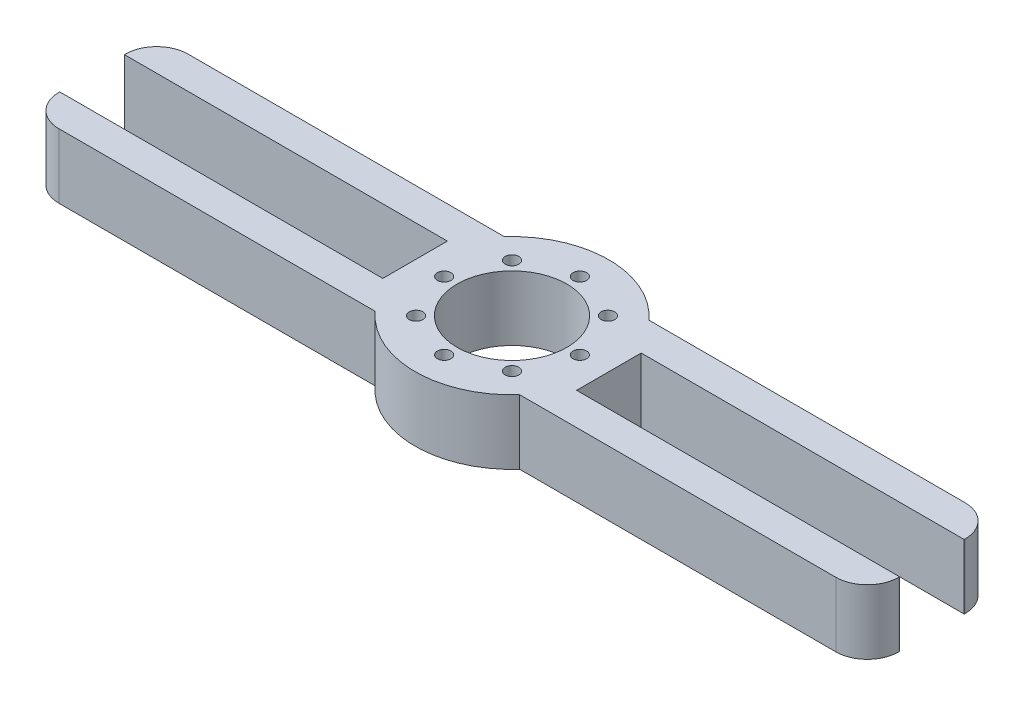
ISO-10303-21;
HEADER;
FILE_DESCRIPTION(('STEP AP214'),'2;1');
FILE_NAME('part.step','',(''),(''),'','','');
FILE_SCHEMA(('AUTOMOTIVE_DESIGN { 1 0 10303 214 1 1 1 1 }'));
ENDSEC;
DATA;
#1=APPLICATION_CONTEXT('core data for automotive mechanical design processes');
#2=APPLICATION_PROTOCOL_DEFINITION('international standard','automotive_design',2000,#1);
#3=PRODUCT_CONTEXT('',#1,'mechanical');
#4=PRODUCT('Part','Part','',(#3));
#5=PRODUCT_RELATED_PRODUCT_CATEGORY('part','',(#4));
#6=PRODUCT_DEFINITION_FORMATION('','',#4);
#7=PRODUCT_DEFINITION_CONTEXT('part definition',#1,'design');
#8=PRODUCT_DEFINITION('design','',#6,#7);
#9=PRODUCT_DEFINITION_SHAPE('','',#8);
#10=(LENGTH_UNIT() NAMED_UNIT(*) SI_UNIT(.MILLI.,.METRE.));
#11=(NAMED_UNIT(*) PLANE_ANGLE_UNIT() SI_UNIT($,.RADIAN.));
#12=(NAMED_UNIT(*) SI_UNIT($,.STERADIAN.) SOLID_ANGLE_UNIT());
#13=UNCERTAINTY_MEASURE_WITH_UNIT(LENGTH_MEASURE(1.E-05),#10,'distance_accuracy_value','');
#14=(GEOMETRIC_REPRESENTATION_CONTEXT(3) GLOBAL_UNCERTAINTY_ASSIGNED_CONTEXT((#13)) GLOBAL_UNIT_ASSIGNED_CONTEXT((#10,
#11,#12)) REPRESENTATION_CONTEXT('',''));
#15=CARTESIAN_POINT('',(0.,0.,0.));
#16=DIRECTION('',(0.,0.,1.));
#17=DIRECTION('',(1.,0.,0.));
#18=AXIS2_PLACEMENT_3D('',#15,#16,#17);
#19=CARTESIAN_POINT('',(0.,20.,0.));
#20=DIRECTION('',(0.,1.,0.));
#21=DIRECTION('',(0.,0.,1.));
#22=AXIS2_PLACEMENT_3D('',#19,#20,#21);
#23=PLANE('',#22);
#24=CARTESIAN_POINT('',(21.,20.,0.));
#25=DIRECTION('',(0.,1.,0.));
#26=DIRECTION('',(0.,0.,1.));
#27=AXIS2_PLACEMENT_3D('',#24,#25,#26);
#28=CIRCLE('',#27,2.1);
#29=CARTESIAN_POINT('',(21.,20.,2.1));
#30=VERTEX_POINT('',#29);
#31=EDGE_CURVE('E460',#30,#30,#28,.T.);
#32=ORIENTED_EDGE('',*,*,#31,.F.);
#33=EDGE_LOOP('',(#32));
#34=FACE_BOUND('',#33,.T.);
#35=CARTESIAN_POINT('',(14.8492424049175,20.,14.8492424049175));
#36=DIRECTION('',(0.,1.,0.));
#37=DIRECTION('',(0.,0.,1.));
#38=AXIS2_PLACEMENT_3D('',#35,#36,#37);
#39=CIRCLE('',#38,2.1);
#40=CARTESIAN_POINT('',(14.8492424049175,20.,16.9492424049175));
#41=VERTEX_POINT('',#40);
#42=EDGE_CURVE('E456',#41,#41,#39,.T.);
#43=ORIENTED_EDGE('',*,*,#42,.F.);
#44=EDGE_LOOP('',(#43));
#45=FACE_BOUND('',#44,.T.);
#46=CARTESIAN_POINT('',(0.,20.,21.));
#47=DIRECTION('',(0.,1.,0.));
#48=DIRECTION('',(0.,0.,1.));
#49=AXIS2_PLACEMENT_3D('',#46,#47,#48);
#50=CIRCLE('',#49,2.1);
#51=CARTESIAN_POINT('',(0.,20.,23.1));
#52=VERTEX_POINT('',#51);
#53=EDGE_CURVE('E448',#52,#52,#50,.T.);
#54=ORIENTED_EDGE('',*,*,#53,.F.);
#55=EDGE_LOOP('',(#54));
#56=FACE_BOUND('',#55,.T.);
#57=CARTESIAN_POINT('',(-14.8492424049176,20.,14.8492424049174));
#58=DIRECTION('',(0.,1.,0.));
#59=DIRECTION('',(0.,0.,1.));
#60=AXIS2_PLACEMENT_3D('',#57,#58,#59);
#61=CIRCLE('',#60,2.1);
#62=CARTESIAN_POINT('',(-14.8492424049176,20.,16.9492424049174));
#63=VERTEX_POINT('',#62);
#64=EDGE_CURVE('E440',#63,#63,#61,.T.);
#65=ORIENTED_EDGE('',*,*,#64,.F.);
#66=EDGE_LOOP('',(#65));
#67=FACE_BOUND('',#66,.T.);
#68=CARTESIAN_POINT('',(-21.,20.,-1.46642216231412E-13));
#69=DIRECTION('',(0.,1.,0.));
#70=DIRECTION('',(0.,0.,1.));
#71=AXIS2_PLACEMENT_3D('',#68,#69,#70);
#72=CIRCLE('',#71,2.1);
#73=CARTESIAN_POINT('',(-21.,20.,2.09999999999985));
#74=VERTEX_POINT('',#73);
#75=EDGE_CURVE('E432',#74,#74,#72,.T.);
#76=ORIENTED_EDGE('',*,*,#75,.F.);
#77=EDGE_LOOP('',(#76));
#78=FACE_BOUND('',#77,.T.);
#79=CARTESIAN_POINT('',(-14.8492424049174,20.,-14.8492424049176));
#80=DIRECTION('',(0.,1.,0.));
#81=DIRECTION('',(0.,0.,1.));
#82=AXIS2_PLACEMENT_3D('',#79,#80,#81);
#83=CIRCLE('',#82,2.1);
#84=CARTESIAN_POINT('',(-14.8492424049174,20.,-12.7492424049176));
#85=VERTEX_POINT('',#84);
#86=EDGE_CURVE('E424',#85,#85,#83,.T.);
#87=ORIENTED_EDGE('',*,*,#86,.F.);
#88=EDGE_LOOP('',(#87));
#89=FACE_BOUND('',#88,.T.);
#90=CARTESIAN_POINT('',(2.19963324347117E-13,20.,-21.));
#91=DIRECTION('',(0.,1.,0.));
#92=DIRECTION('',(0.,0.,1.));
#93=AXIS2_PLACEMENT_3D('',#90,#91,#92);
#94=CIRCLE('',#93,2.1);
#95=CARTESIAN_POINT('',(2.19963324347117E-13,20.,-18.9));
#96=VERTEX_POINT('',#95);
#97=EDGE_CURVE('E416',#96,#96,#94,.T.);
#98=ORIENTED_EDGE('',*,*,#97,.F.);
#99=EDGE_LOOP('',(#98));
#100=FACE_BOUND('',#99,.T.);
#101=CARTESIAN_POINT('',(14.8492424049177,20.,-14.8492424049173));
#102=DIRECTION('',(0.,1.,0.));
#103=DIRECTION('',(0.,0.,1.));
#104=AXIS2_PLACEMENT_3D('',#101,#102,#103);
#105=CIRCLE('',#104,2.1);
#106=CARTESIAN_POINT('',(14.8492424049177,20.,-12.7492424049173));
#107=VERTEX_POINT('',#106);
#108=EDGE_CURVE('E407',#107,#107,#105,.T.);
#109=ORIENTED_EDGE('',*,*,#108,.F.);
#110=EDGE_LOOP('',(#109));
#111=FACE_BOUND('',#110,.T.);
#112=DIRECTION('',(0.,0.,-1.));
#113=VECTOR('',#112,1.);
#114=CARTESIAN_POINT('',(-130.,20.,-20.));
#115=LINE('',#114,#113);
#116=CARTESIAN_POINT('',(-130.,20.,10.25));
#117=VERTEX_POINT('',#116);
#118=CARTESIAN_POINT('',(-130.,20.,10.));
#119=VERTEX_POINT('',#118);
#120=EDGE_CURVE('E183',#117,#119,#115,.T.);
#121=ORIENTED_EDGE('',*,*,#120,.F.);
#122=CARTESIAN_POINT('',(-120.25,20.,10.25));
#123=DIRECTION('',(0.,1.,0.));
#124=DIRECTION('',(0.,0.,1.));
#125=AXIS2_PLACEMENT_3D('',#122,#123,#124);
#126=CIRCLE('',#125,9.75);
#127=CARTESIAN_POINT('',(-120.25,20.,20.));
#128=VERTEX_POINT('',#127);
#129=EDGE_CURVE('E384',#117,#128,#126,.T.);
#130=ORIENTED_EDGE('',*,*,#129,.T.);
#131=DIRECTION('',(-1.,0.,0.));
#132=VECTOR('',#131,1.);
#133=CARTESIAN_POINT('',(-130.,20.,20.));
#134=LINE('',#133,#132);
#135=CARTESIAN_POINT('',(-22.3606797749979,20.,20.));
#136=VERTEX_POINT('',#135);
#137=EDGE_CURVE('E193',#136,#128,#134,.T.);
#138=ORIENTED_EDGE('',*,*,#137,.F.);
#139=CARTESIAN_POINT('',(0.,20.,0.));
#140=DIRECTION('',(0.,1.,0.));
#141=DIRECTION('',(0.,0.,1.));
#142=AXIS2_PLACEMENT_3D('',#139,#140,#141);
#143=CIRCLE('',#142,30.);
#144=CARTESIAN_POINT('',(22.3606797749979,20.,20.));
#145=VERTEX_POINT('',#144);
#146=EDGE_CURVE('E305',#136,#145,#143,.T.);
#147=ORIENTED_EDGE('',*,*,#146,.T.);
#148=DIRECTION('',(1.,0.,0.));
#149=VECTOR('',#148,1.);
#150=CARTESIAN_POINT('',(130.,20.,20.));
#151=LINE('',#150,#149);
#152=CARTESIAN_POINT('',(120.25,20.,20.));
#153=VERTEX_POINT('',#152);
#154=EDGE_CURVE('E309',#145,#153,#151,.T.);
#155=ORIENTED_EDGE('',*,*,#154,.T.);
#156=CARTESIAN_POINT('',(120.25,20.,10.25));
#157=DIRECTION('',(0.,1.,0.));
#158=DIRECTION('',(0.,0.,1.));
#159=AXIS2_PLACEMENT_3D('',#156,#157,#158);
#160=CIRCLE('',#159,9.75);
#161=CARTESIAN_POINT('',(130.,20.,10.25));
#162=VERTEX_POINT('',#161);
#163=EDGE_CURVE('E360',#153,#162,#160,.T.);
#164=ORIENTED_EDGE('',*,*,#163,.T.);
#165=DIRECTION('',(0.,0.,-1.));
#166=VECTOR('',#165,1.);
#167=CARTESIAN_POINT('',(130.,20.,-20.));
#168=LINE('',#167,#166);
#169=CARTESIAN_POINT('',(130.,20.,10.));
#170=VERTEX_POINT('',#169);
#171=EDGE_CURVE('E314',#162,#170,#168,.T.);
#172=ORIENTED_EDGE('',*,*,#171,.T.);
#173=DIRECTION('',(1.,0.,0.));
#174=VECTOR('',#173,1.);
#175=CARTESIAN_POINT('',(30.,20.,10.));
#176=LINE('',#175,#174);
#177=CARTESIAN_POINT('',(30.,20.,10.));
#178=VERTEX_POINT('',#177);
#179=EDGE_CURVE('E274',#178,#170,#176,.T.);
#180=ORIENTED_EDGE('',*,*,#179,.F.);
#181=DIRECTION('',(0.,0.,1.));
#182=VECTOR('',#181,1.);
#183=CARTESIAN_POINT('',(30.,20.,-10.));
#184=LINE('',#183,#182);
#185=CARTESIAN_POINT('',(30.,20.,-10.));
#186=VERTEX_POINT('',#185);
#187=EDGE_CURVE('E289',#186,#178,#184,.T.);
#188=ORIENTED_EDGE('',*,*,#187,.F.);
#189=DIRECTION('',(-1.,0.,0.));
#190=VECTOR('',#189,1.);
#191=CARTESIAN_POINT('',(130.,20.,-10.));
#192=LINE('',#191,#190);
#193=CARTESIAN_POINT('',(130.,20.,-10.));
#194=VERTEX_POINT('',#193);
#195=EDGE_CURVE('E267',#194,#186,#192,.T.);
#196=ORIENTED_EDGE('',*,*,#195,.F.);
#197=CARTESIAN_POINT('',(130.,20.,-10.25));
#198=VERTEX_POINT('',#197);
#199=EDGE_CURVE('E313',#194,#198,#168,.T.);
#200=ORIENTED_EDGE('',*,*,#199,.T.);
#201=CARTESIAN_POINT('',(120.25,20.,-10.25));
#202=DIRECTION('',(0.,1.,0.));
#203=DIRECTION('',(0.,0.,1.));
#204=AXIS2_PLACEMENT_3D('',#201,#202,#203);
#205=CIRCLE('',#204,9.75);
#206=CARTESIAN_POINT('',(120.25,20.,-20.));
#207=VERTEX_POINT('',#206);
#208=EDGE_CURVE('E357',#198,#207,#205,.T.);
#209=ORIENTED_EDGE('',*,*,#208,.T.);
#210=DIRECTION('',(-1.,0.,0.));
#211=VECTOR('',#210,1.);
#212=CARTESIAN_POINT('',(22.3606797749979,20.,-20.));
#213=LINE('',#212,#211);
#214=CARTESIAN_POINT('',(22.3606797749979,20.,-20.));
#215=VERTEX_POINT('',#214);
#216=EDGE_CURVE('E317',#207,#215,#213,.T.);
#217=ORIENTED_EDGE('',*,*,#216,.T.);
#218=CARTESIAN_POINT('',(0.,20.,0.));
#219=DIRECTION('',(0.,1.,0.));
#220=DIRECTION('',(0.,0.,1.));
#221=AXIS2_PLACEMENT_3D('',#218,#219,#220);
#222=CIRCLE('',#221,30.);
#223=CARTESIAN_POINT('',(-22.3606797749979,20.,-20.));
#224=VERTEX_POINT('',#223);
#225=EDGE_CURVE('E301',#215,#224,#222,.T.);
#226=ORIENTED_EDGE('',*,*,#225,.T.);
#227=DIRECTION('',(1.,0.,0.));
#228=VECTOR('',#227,1.);
#229=CARTESIAN_POINT('',(-22.3606797749979,20.,-20.));
#230=LINE('',#229,#228);
#231=CARTESIAN_POINT('',(-120.25,20.,-20.));
#232=VERTEX_POINT('',#231);
#233=EDGE_CURVE('E231',#232,#224,#230,.T.);
#234=ORIENTED_EDGE('',*,*,#233,.F.);
#235=CARTESIAN_POINT('',(-120.25,20.,-10.25));
#236=DIRECTION('',(0.,1.,0.));
#237=DIRECTION('',(0.,0.,1.));
#238=AXIS2_PLACEMENT_3D('',#235,#236,#237);
#239=CIRCLE('',#238,9.75);
#240=CARTESIAN_POINT('',(-130.,20.,-10.25));
#241=VERTEX_POINT('',#240);
#242=EDGE_CURVE('E61',#232,#241,#239,.T.);
#243=ORIENTED_EDGE('',*,*,#242,.T.);
#244=CARTESIAN_POINT('',(-130.,20.,-10.));
#245=VERTEX_POINT('',#244);
#246=EDGE_CURVE('E194',#245,#241,#115,.T.);
#247=ORIENTED_EDGE('',*,*,#246,.F.);
#248=DIRECTION('',(1.,0.,0.));
#249=VECTOR('',#248,1.);
#250=CARTESIAN_POINT('',(-130.,20.,-10.));
#251=LINE('',#250,#249);
#252=CARTESIAN_POINT('',(-30.,20.,-10.));
#253=VERTEX_POINT('',#252);
#254=EDGE_CURVE('E214',#245,#253,#251,.T.);
#255=ORIENTED_EDGE('',*,*,#254,.T.);
#256=DIRECTION('',(0.,0.,1.));
#257=VECTOR('',#256,1.);
#258=CARTESIAN_POINT('',(-30.,20.,-10.));
#259=LINE('',#258,#257);
#260=CARTESIAN_POINT('',(-30.,20.,10.));
#261=VERTEX_POINT('',#260);
#262=EDGE_CURVE('E212',#253,#261,#259,.T.);
#263=ORIENTED_EDGE('',*,*,#262,.T.);
#264=DIRECTION('',(-1.,0.,0.));
#265=VECTOR('',#264,1.);
#266=CARTESIAN_POINT('',(-30.,20.,10.));
#267=LINE('',#266,#265);
#268=EDGE_CURVE('E201',#261,#119,#267,.T.);
#269=ORIENTED_EDGE('',*,*,#268,.T.);
#270=EDGE_LOOP('',(#121,#130,#138,#147,#155,#164,#172,#180,#188,#196,#200,#209,#217,#226,#234,
#243,#247,#255,#263,#269));
#271=FACE_BOUND('',#270,.T.);
#272=CARTESIAN_POINT('',(0.,20.,0.));
#273=DIRECTION('',(0.,1.,0.));
#274=DIRECTION('',(0.,0.,1.));
#275=AXIS2_PLACEMENT_3D('',#272,#273,#274);
#276=CIRCLE('',#275,17.);
#277=CARTESIAN_POINT('',(0.,20.,17.));
#278=VERTEX_POINT('',#277);
#279=EDGE_CURVE('E263',#278,#278,#276,.T.);
#280=ORIENTED_EDGE('',*,*,#279,.F.);
#281=EDGE_LOOP('',(#280));
#282=FACE_BOUND('',#281,.T.);
#283=ADVANCED_FACE('F45',(#34,#45,#56,#67,#78,#89,#100,#111,#271,#282),#23,.T.);
#284=CARTESIAN_POINT('',(0.,0.,0.));
#285=DIRECTION('',(0.,1.,0.));
#286=DIRECTION('',(0.,0.,1.));
#287=AXIS2_PLACEMENT_3D('',#284,#285,#286);
#288=PLANE('',#287);
#289=CARTESIAN_POINT('',(21.,0.,0.));
#290=DIRECTION('',(0.,1.,0.));
#291=DIRECTION('',(0.,0.,1.));
#292=AXIS2_PLACEMENT_3D('',#289,#290,#291);
#293=CIRCLE('',#292,2.1);
#294=CARTESIAN_POINT('',(21.,0.,2.1));
#295=VERTEX_POINT('',#294);
#296=EDGE_CURVE('E219',#295,#295,#293,.F.);
#297=ORIENTED_EDGE('',*,*,#296,.F.);
#298=EDGE_LOOP('',(#297));
#299=FACE_BOUND('',#298,.T.);
#300=CARTESIAN_POINT('',(14.8492424049175,0.,14.8492424049175));
#301=DIRECTION('',(0.,1.,0.));
#302=DIRECTION('',(0.,0.,1.));
#303=AXIS2_PLACEMENT_3D('',#300,#301,#302);
#304=CIRCLE('',#303,2.1);
#305=CARTESIAN_POINT('',(14.8492424049175,0.,16.9492424049175));
#306=VERTEX_POINT('',#305);
#307=EDGE_CURVE('E452',#306,#306,#304,.F.);
#308=ORIENTED_EDGE('',*,*,#307,.F.);
#309=EDGE_LOOP('',(#308));
#310=FACE_BOUND('',#309,.T.);
#311=CARTESIAN_POINT('',(0.,0.,21.));
#312=DIRECTION('',(0.,1.,0.));
#313=DIRECTION('',(0.,0.,1.));
#314=AXIS2_PLACEMENT_3D('',#311,#312,#313);
#315=CIRCLE('',#314,2.1);
#316=CARTESIAN_POINT('',(0.,0.,23.1));
#317=VERTEX_POINT('',#316);
#318=EDGE_CURVE('E444',#317,#317,#315,.F.);
#319=ORIENTED_EDGE('',*,*,#318,.F.);
#320=EDGE_LOOP('',(#319));
#321=FACE_BOUND('',#320,.T.);
#322=CARTESIAN_POINT('',(-14.8492424049176,0.,14.8492424049174));
#323=DIRECTION('',(0.,1.,0.));
#324=DIRECTION('',(0.,0.,1.));
#325=AXIS2_PLACEMENT_3D('',#322,#323,#324);
#326=CIRCLE('',#325,2.1);
#327=CARTESIAN_POINT('',(-14.8492424049176,0.,16.9492424049174));
#328=VERTEX_POINT('',#327);
#329=EDGE_CURVE('E436',#328,#328,#326,.F.);
#330=ORIENTED_EDGE('',*,*,#329,.F.);
#331=EDGE_LOOP('',(#330));
#332=FACE_BOUND('',#331,.T.);
#333=CARTESIAN_POINT('',(-21.,0.,-1.46642216231412E-13));
#334=DIRECTION('',(0.,1.,0.));
#335=DIRECTION('',(0.,0.,1.));
#336=AXIS2_PLACEMENT_3D('',#333,#334,#335);
#337=CIRCLE('',#336,2.1);
#338=CARTESIAN_POINT('',(-21.,0.,2.09999999999985));
#339=VERTEX_POINT('',#338);
#340=EDGE_CURVE('E428',#339,#339,#337,.F.);
#341=ORIENTED_EDGE('',*,*,#340,.F.);
#342=EDGE_LOOP('',(#341));
#343=FACE_BOUND('',#342,.T.);
#344=CARTESIAN_POINT('',(-14.8492424049174,0.,-14.8492424049176));
#345=DIRECTION('',(0.,1.,0.));
#346=DIRECTION('',(0.,0.,1.));
#347=AXIS2_PLACEMENT_3D('',#344,#345,#346);
#348=CIRCLE('',#347,2.1);
#349=CARTESIAN_POINT('',(-14.8492424049174,0.,-12.7492424049176));
#350=VERTEX_POINT('',#349);
#351=EDGE_CURVE('E420',#350,#350,#348,.F.);
#352=ORIENTED_EDGE('',*,*,#351,.F.);
#353=EDGE_LOOP('',(#352));
#354=FACE_BOUND('',#353,.T.);
#355=CARTESIAN_POINT('',(2.19963324347117E-13,0.,-21.));
#356=DIRECTION('',(0.,1.,0.));
#357=DIRECTION('',(0.,0.,1.));
#358=AXIS2_PLACEMENT_3D('',#355,#356,#357);
#359=CIRCLE('',#358,2.1);
#360=CARTESIAN_POINT('',(2.19963324347117E-13,0.,-18.9));
#361=VERTEX_POINT('',#360);
#362=EDGE_CURVE('E411',#361,#361,#359,.F.);
#363=ORIENTED_EDGE('',*,*,#362,.F.);
#364=EDGE_LOOP('',(#363));
#365=FACE_BOUND('',#364,.T.);
#366=CARTESIAN_POINT('',(14.8492424049177,0.,-14.8492424049173));
#367=DIRECTION('',(0.,1.,0.));
#368=DIRECTION('',(0.,0.,1.));
#369=AXIS2_PLACEMENT_3D('',#366,#367,#368);
#370=CIRCLE('',#369,2.1);
#371=CARTESIAN_POINT('',(14.8492424049177,0.,-12.7492424049173));
#372=VERTEX_POINT('',#371);
#373=EDGE_CURVE('E412',#372,#372,#370,.F.);
#374=ORIENTED_EDGE('',*,*,#373,.F.);
#375=EDGE_LOOP('',(#374));
#376=FACE_BOUND('',#375,.T.);
#377=DIRECTION('',(-1.,0.,0.));
#378=VECTOR('',#377,1.);
#379=CARTESIAN_POINT('',(-130.,0.,20.));
#380=LINE('',#379,#378);
#381=CARTESIAN_POINT('',(-22.3606797749979,0.,20.));
#382=VERTEX_POINT('',#381);
#383=CARTESIAN_POINT('',(-120.25,0.,20.));
#384=VERTEX_POINT('',#383);
#385=EDGE_CURVE('E233',#382,#384,#380,.T.);
#386=ORIENTED_EDGE('',*,*,#385,.T.);
#387=CARTESIAN_POINT('',(-120.25,0.,10.25));
#388=DIRECTION('',(0.,1.,0.));
#389=DIRECTION('',(0.,0.,1.));
#390=AXIS2_PLACEMENT_3D('',#387,#388,#389);
#391=CIRCLE('',#390,9.75);
#392=CARTESIAN_POINT('',(-130.,0.,10.25));
#393=VERTEX_POINT('',#392);
#394=EDGE_CURVE('E377',#384,#393,#391,.F.);
#395=ORIENTED_EDGE('',*,*,#394,.T.);
#396=DIRECTION('',(0.,0.,-1.));
#397=VECTOR('',#396,1.);
#398=CARTESIAN_POINT('',(-130.,0.,-20.));
#399=LINE('',#398,#397);
#400=CARTESIAN_POINT('',(-130.,0.,10.));
#401=VERTEX_POINT('',#400);
#402=EDGE_CURVE('E244',#393,#401,#399,.T.);
#403=ORIENTED_EDGE('',*,*,#402,.T.);
#404=DIRECTION('',(1.,0.,0.));
#405=VECTOR('',#404,1.);
#406=CARTESIAN_POINT('',(-30.,0.,10.));
#407=LINE('',#406,#405);
#408=CARTESIAN_POINT('',(-30.,0.,10.));
#409=VERTEX_POINT('',#408);
#410=EDGE_CURVE('E204',#401,#409,#407,.T.);
#411=ORIENTED_EDGE('',*,*,#410,.T.);
#412=DIRECTION('',(0.,0.,-1.));
#413=VECTOR('',#412,1.);
#414=CARTESIAN_POINT('',(-30.,0.,-10.));
#415=LINE('',#414,#413);
#416=CARTESIAN_POINT('',(-30.,0.,-10.));
#417=VERTEX_POINT('',#416);
#418=EDGE_CURVE('E402',#409,#417,#415,.T.);
#419=ORIENTED_EDGE('',*,*,#418,.T.);
#420=DIRECTION('',(-1.,0.,0.));
#421=VECTOR('',#420,1.);
#422=CARTESIAN_POINT('',(-130.,0.,-10.));
#423=LINE('',#422,#421);
#424=CARTESIAN_POINT('',(-130.,0.,-10.));
#425=VERTEX_POINT('',#424);
#426=EDGE_CURVE('E243',#417,#425,#423,.T.);
#427=ORIENTED_EDGE('',*,*,#426,.T.);
#428=CARTESIAN_POINT('',(-130.,0.,-10.25));
#429=VERTEX_POINT('',#428);
#430=EDGE_CURVE('E242',#425,#429,#399,.T.);
#431=ORIENTED_EDGE('',*,*,#430,.T.);
#432=CARTESIAN_POINT('',(-120.25,0.,-10.25));
#433=DIRECTION('',(0.,1.,0.));
#434=DIRECTION('',(0.,0.,1.));
#435=AXIS2_PLACEMENT_3D('',#432,#433,#434);
#436=CIRCLE('',#435,9.75);
#437=CARTESIAN_POINT('',(-120.25,0.,-20.));
#438=VERTEX_POINT('',#437);
#439=EDGE_CURVE('E374',#429,#438,#436,.F.);
#440=ORIENTED_EDGE('',*,*,#439,.T.);
#441=DIRECTION('',(1.,0.,0.));
#442=VECTOR('',#441,1.);
#443=CARTESIAN_POINT('',(-22.3606797749979,0.,-20.));
#444=LINE('',#443,#442);
#445=CARTESIAN_POINT('',(-22.3606797749979,0.,-20.));
#446=VERTEX_POINT('',#445);
#447=EDGE_CURVE('E239',#438,#446,#444,.T.);
#448=ORIENTED_EDGE('',*,*,#447,.T.);
#449=CARTESIAN_POINT('',(0.,0.,0.));
#450=DIRECTION('',(0.,1.,0.));
#451=DIRECTION('',(0.,0.,1.));
#452=AXIS2_PLACEMENT_3D('',#449,#450,#451);
#453=CIRCLE('',#452,30.);
#454=CARTESIAN_POINT('',(22.3606797749979,0.,-20.));
#455=VERTEX_POINT('',#454);
#456=EDGE_CURVE('E262',#455,#446,#453,.T.);
#457=ORIENTED_EDGE('',*,*,#456,.F.);
#458=DIRECTION('',(-1.,0.,0.));
#459=VECTOR('',#458,1.);
#460=CARTESIAN_POINT('',(22.3606797749979,0.,-20.));
#461=LINE('',#460,#459);
#462=CARTESIAN_POINT('',(120.25,0.,-20.));
#463=VERTEX_POINT('',#462);
#464=EDGE_CURVE('E306',#463,#455,#461,.T.);
#465=ORIENTED_EDGE('',*,*,#464,.F.);
#466=CARTESIAN_POINT('',(120.25,0.,-10.25));
#467=DIRECTION('',(0.,1.,0.));
#468=DIRECTION('',(0.,0.,1.));
#469=AXIS2_PLACEMENT_3D('',#466,#467,#468);
#470=CIRCLE('',#469,9.75);
#471=CARTESIAN_POINT('',(130.,0.,-10.25));
#472=VERTEX_POINT('',#471);
#473=EDGE_CURVE('E348',#463,#472,#470,.F.);
#474=ORIENTED_EDGE('',*,*,#473,.T.);
#475=DIRECTION('',(0.,0.,-1.));
#476=VECTOR('',#475,1.);
#477=CARTESIAN_POINT('',(130.,0.,-20.));
#478=LINE('',#477,#476);
#479=CARTESIAN_POINT('',(130.,0.,-10.));
#480=VERTEX_POINT('',#479);
#481=EDGE_CURVE('E331',#480,#472,#478,.T.);
#482=ORIENTED_EDGE('',*,*,#481,.F.);
#483=DIRECTION('',(1.,0.,0.));
#484=VECTOR('',#483,1.);
#485=CARTESIAN_POINT('',(130.,0.,-10.));
#486=LINE('',#485,#484);
#487=CARTESIAN_POINT('',(30.,0.,-10.));
#488=VERTEX_POINT('',#487);
#489=EDGE_CURVE('E270',#488,#480,#486,.T.);
#490=ORIENTED_EDGE('',*,*,#489,.F.);
#491=DIRECTION('',(0.,0.,-1.));
#492=VECTOR('',#491,1.);
#493=CARTESIAN_POINT('',(30.,0.,-10.));
#494=LINE('',#493,#492);
#495=CARTESIAN_POINT('',(30.,0.,10.));
#496=VERTEX_POINT('',#495);
#497=EDGE_CURVE('E257',#496,#488,#494,.T.);
#498=ORIENTED_EDGE('',*,*,#497,.F.);
#499=DIRECTION('',(-1.,0.,0.));
#500=VECTOR('',#499,1.);
#501=CARTESIAN_POINT('',(30.,0.,10.));
#502=LINE('',#501,#500);
#503=CARTESIAN_POINT('',(130.,0.,10.));
#504=VERTEX_POINT('',#503);
#505=EDGE_CURVE('E285',#504,#496,#502,.T.);
#506=ORIENTED_EDGE('',*,*,#505,.F.);
#507=CARTESIAN_POINT('',(130.,0.,10.25));
#508=VERTEX_POINT('',#507);
#509=EDGE_CURVE('E332',#508,#504,#478,.T.);
#510=ORIENTED_EDGE('',*,*,#509,.F.);
#511=CARTESIAN_POINT('',(120.25,0.,10.25));
#512=DIRECTION('',(0.,1.,0.));
#513=DIRECTION('',(0.,0.,1.));
#514=AXIS2_PLACEMENT_3D('',#511,#512,#513);
#515=CIRCLE('',#514,9.75);
#516=CARTESIAN_POINT('',(120.25,0.,20.));
#517=VERTEX_POINT('',#516);
#518=EDGE_CURVE('E351',#508,#517,#515,.F.);
#519=ORIENTED_EDGE('',*,*,#518,.T.);
#520=DIRECTION('',(1.,0.,0.));
#521=VECTOR('',#520,1.);
#522=CARTESIAN_POINT('',(130.,0.,20.));
#523=LINE('',#522,#521);
#524=CARTESIAN_POINT('',(22.3606797749979,0.,20.));
#525=VERTEX_POINT('',#524);
#526=EDGE_CURVE('E327',#525,#517,#523,.T.);
#527=ORIENTED_EDGE('',*,*,#526,.F.);
#528=CARTESIAN_POINT('',(0.,0.,0.));
#529=DIRECTION('',(0.,1.,0.));
#530=DIRECTION('',(0.,0.,1.));
#531=AXIS2_PLACEMENT_3D('',#528,#529,#530);
#532=CIRCLE('',#531,30.);
#533=EDGE_CURVE('E324',#382,#525,#532,.T.);
#534=ORIENTED_EDGE('',*,*,#533,.F.);
#535=EDGE_LOOP('',(#386,#395,#403,#411,#419,#427,#431,#440,#448,#457,#465,#474,#482,#490,#498,
#506,#510,#519,#527,#534));
#536=FACE_BOUND('',#535,.T.);
#537=CARTESIAN_POINT('',(0.,0.,0.));
#538=DIRECTION('',(0.,1.,0.));
#539=DIRECTION('',(0.,0.,1.));
#540=AXIS2_PLACEMENT_3D('',#537,#538,#539);
#541=CIRCLE('',#540,17.);
#542=CARTESIAN_POINT('',(0.,0.,17.));
#543=VERTEX_POINT('',#542);
#544=EDGE_CURVE('E258',#543,#543,#541,.F.);
#545=ORIENTED_EDGE('',*,*,#544,.F.);
#546=EDGE_LOOP('',(#545));
#547=FACE_BOUND('',#546,.T.);
#548=ADVANCED_FACE('F396',(#299,#310,#321,#332,#343,#354,#365,#376,#536,#547),#288,.F.);
#549=CARTESIAN_POINT('',(-130.,20.,-20.));
#550=DIRECTION('',(-1.,0.,0.));
#551=DIRECTION('',(0.,0.,1.));
#552=AXIS2_PLACEMENT_3D('',#549,#550,#551);
#553=PLANE('',#552);
#554=ORIENTED_EDGE('',*,*,#402,.F.);
#555=DIRECTION('',(0.,-1.,0.));
#556=VECTOR('',#555,1.);
#557=CARTESIAN_POINT('',(-130.,20.,10.25));
#558=LINE('',#557,#556);
#559=EDGE_CURVE('E189',#393,#117,#558,.F.);
#560=ORIENTED_EDGE('',*,*,#559,.T.);
#561=ORIENTED_EDGE('',*,*,#120,.T.);
#562=DIRECTION('',(0.,1.,0.));
#563=VECTOR('',#562,1.);
#564=CARTESIAN_POINT('',(-130.,-101.980390271856,10.));
#565=LINE('',#564,#563);
#566=EDGE_CURVE('E187',#401,#119,#565,.T.);
#567=ORIENTED_EDGE('',*,*,#566,.F.);
#568=EDGE_LOOP('',(#554,#560,#561,#567));
#569=FACE_BOUND('',#568,.T.);
#570=ADVANCED_FACE('F186',(#569),#553,.T.);
#571=ORIENTED_EDGE('',*,*,#246,.T.);
#572=DIRECTION('',(0.,-1.,0.));
#573=VECTOR('',#572,1.);
#574=CARTESIAN_POINT('',(-130.,20.,-10.25));
#575=LINE('',#574,#573);
#576=EDGE_CURVE('E54',#241,#429,#575,.T.);
#577=ORIENTED_EDGE('',*,*,#576,.T.);
#578=ORIENTED_EDGE('',*,*,#430,.F.);
#579=DIRECTION('',(0.,1.,0.));
#580=VECTOR('',#579,1.);
#581=CARTESIAN_POINT('',(-130.,-101.980390271856,-10.));
#582=LINE('',#581,#580);
#583=EDGE_CURVE('E207',#425,#245,#582,.T.);
#584=ORIENTED_EDGE('',*,*,#583,.T.);
#585=EDGE_LOOP('',(#571,#577,#578,#584));
#586=FACE_BOUND('',#585,.T.);
#587=ADVANCED_FACE('F392',(#586),#553,.T.);
#588=CARTESIAN_POINT('',(130.,20.,-20.));
#589=DIRECTION('',(-1.,0.,0.));
#590=DIRECTION('',(0.,0.,1.));
#591=AXIS2_PLACEMENT_3D('',#588,#589,#590);
#592=PLANE('',#591);
#593=ORIENTED_EDGE('',*,*,#481,.T.);
#594=DIRECTION('',(0.,-1.,0.));
#595=VECTOR('',#594,1.);
#596=CARTESIAN_POINT('',(130.,20.,-10.25));
#597=LINE('',#596,#595);
#598=EDGE_CURVE('E367',#472,#198,#597,.F.);
#599=ORIENTED_EDGE('',*,*,#598,.T.);
#600=ORIENTED_EDGE('',*,*,#199,.F.);
#601=DIRECTION('',(0.,1.,0.));
#602=VECTOR('',#601,1.);
#603=CARTESIAN_POINT('',(130.,-101.980390271856,-10.));
#604=LINE('',#603,#602);
#605=EDGE_CURVE('E282',#480,#194,#604,.T.);
#606=ORIENTED_EDGE('',*,*,#605,.F.);
#607=EDGE_LOOP('',(#593,#599,#600,#606));
#608=FACE_BOUND('',#607,.T.);
#609=ADVANCED_FACE('F554',(#608),#592,.F.);
#610=CARTESIAN_POINT('',(0.,20.,0.));
#611=DIRECTION('',(0.,-1.,0.));
#612=DIRECTION('',(0.,0.,-1.));
#613=AXIS2_PLACEMENT_3D('',#610,#611,#612);
#614=CYLINDRICAL_SURFACE('',#613,30.);
#615=ORIENTED_EDGE('',*,*,#456,.T.);
#616=DIRECTION('',(0.,-1.,0.));
#617=VECTOR('',#616,1.);
#618=CARTESIAN_POINT('',(-22.3606797749979,20.,-20.));
#619=LINE('',#618,#617);
#620=EDGE_CURVE('E253',#224,#446,#619,.T.);
#621=ORIENTED_EDGE('',*,*,#620,.F.);
#622=ORIENTED_EDGE('',*,*,#225,.F.);
#623=DIRECTION('',(0.,-1.,0.));
#624=VECTOR('',#623,1.);
#625=CARTESIAN_POINT('',(22.3606797749979,20.,-20.));
#626=LINE('',#625,#624);
#627=EDGE_CURVE('E320',#215,#455,#626,.T.);
#628=ORIENTED_EDGE('',*,*,#627,.T.);
#629=EDGE_LOOP('',(#615,#621,#622,#628));
#630=FACE_BOUND('',#629,.T.);
#631=ADVANCED_FACE('F561',(#630),#614,.T.);
#632=CARTESIAN_POINT('',(0.,20.,0.));
#633=DIRECTION('',(0.,-1.,0.));
#634=DIRECTION('',(0.,0.,-1.));
#635=AXIS2_PLACEMENT_3D('',#632,#633,#634);
#636=CYLINDRICAL_SURFACE('',#635,30.);
#637=ORIENTED_EDGE('',*,*,#533,.T.);
#638=DIRECTION('',(0.,-1.,0.));
#639=VECTOR('',#638,1.);
#640=CARTESIAN_POINT('',(22.3606797749979,20.,20.));
#641=LINE('',#640,#639);
#642=EDGE_CURVE('E340',#145,#525,#641,.T.);
#643=ORIENTED_EDGE('',*,*,#642,.F.);
#644=ORIENTED_EDGE('',*,*,#146,.F.);
#645=DIRECTION('',(0.,-1.,0.));
#646=VECTOR('',#645,1.);
#647=CARTESIAN_POINT('',(-22.3606797749979,20.,20.));
#648=LINE('',#647,#646);
#649=EDGE_CURVE('E238',#136,#382,#648,.T.);
#650=ORIENTED_EDGE('',*,*,#649,.T.);
#651=EDGE_LOOP('',(#637,#643,#644,#650));
#652=FACE_BOUND('',#651,.T.);
#653=ADVANCED_FACE('F557',(#652),#636,.T.);
#654=CARTESIAN_POINT('',(130.,20.,20.));
#655=DIRECTION('',(0.,0.,-1.));
#656=DIRECTION('',(-1.,0.,0.));
#657=AXIS2_PLACEMENT_3D('',#654,#655,#656);
#658=PLANE('',#657);
#659=ORIENTED_EDGE('',*,*,#526,.T.);
#660=DIRECTION('',(0.,-1.,0.));
#661=VECTOR('',#660,1.);
#662=CARTESIAN_POINT('',(120.25,20.,20.));
#663=LINE('',#662,#661);
#664=EDGE_CURVE('E354',#517,#153,#663,.F.);
#665=ORIENTED_EDGE('',*,*,#664,.T.);
#666=ORIENTED_EDGE('',*,*,#154,.F.);
#667=ORIENTED_EDGE('',*,*,#642,.T.);
#668=EDGE_LOOP('',(#659,#665,#666,#667));
#669=FACE_BOUND('',#668,.T.);
#670=ADVANCED_FACE('F552',(#669),#658,.F.);
#671=ORIENTED_EDGE('',*,*,#171,.F.);
#672=DIRECTION('',(0.,-1.,0.));
#673=VECTOR('',#672,1.);
#674=CARTESIAN_POINT('',(130.,20.,10.25));
#675=LINE('',#674,#673);
#676=EDGE_CURVE('E344',#162,#508,#675,.T.);
#677=ORIENTED_EDGE('',*,*,#676,.T.);
#678=ORIENTED_EDGE('',*,*,#509,.T.);
#679=DIRECTION('',(0.,1.,0.));
#680=VECTOR('',#679,1.);
#681=CARTESIAN_POINT('',(130.,-101.980390271856,10.));
#682=LINE('',#681,#680);
#683=EDGE_CURVE('E278',#504,#170,#682,.T.);
#684=ORIENTED_EDGE('',*,*,#683,.T.);
#685=EDGE_LOOP('',(#671,#677,#678,#684));
#686=FACE_BOUND('',#685,.T.);
#687=ADVANCED_FACE('F548',(#686),#592,.F.);
#688=CARTESIAN_POINT('',(22.3606797749979,20.,-20.));
#689=DIRECTION('',(0.,0.,1.));
#690=DIRECTION('',(1.,0.,0.));
#691=AXIS2_PLACEMENT_3D('',#688,#689,#690);
#692=PLANE('',#691);
#693=ORIENTED_EDGE('',*,*,#216,.F.);
#694=DIRECTION('',(0.,-1.,0.));
#695=VECTOR('',#694,1.);
#696=CARTESIAN_POINT('',(120.25,20.,-20.));
#697=LINE('',#696,#695);
#698=EDGE_CURVE('E363',#207,#463,#697,.T.);
#699=ORIENTED_EDGE('',*,*,#698,.T.);
#700=ORIENTED_EDGE('',*,*,#464,.T.);
#701=ORIENTED_EDGE('',*,*,#627,.F.);
#702=EDGE_LOOP('',(#693,#699,#700,#701));
#703=FACE_BOUND('',#702,.T.);
#704=ADVANCED_FACE('F536',(#703),#692,.F.);
#705=CARTESIAN_POINT('',(130.,-101.980390271856,-10.));
#706=DIRECTION('',(0.,0.,-1.));
#707=DIRECTION('',(-1.,0.,0.));
#708=AXIS2_PLACEMENT_3D('',#705,#706,#707);
#709=PLANE('',#708);
#710=ORIENTED_EDGE('',*,*,#489,.T.);
#711=ORIENTED_EDGE('',*,*,#605,.T.);
#712=ORIENTED_EDGE('',*,*,#195,.T.);
#713=DIRECTION('',(0.,1.,0.));
#714=VECTOR('',#713,1.);
#715=CARTESIAN_POINT('',(30.,-101.980390271856,-10.));
#716=LINE('',#715,#714);
#717=EDGE_CURVE('E271',#488,#186,#716,.T.);
#718=ORIENTED_EDGE('',*,*,#717,.F.);
#719=EDGE_LOOP('',(#710,#711,#712,#718));
#720=FACE_BOUND('',#719,.T.);
#721=ADVANCED_FACE('F532',(#720),#709,.F.);
#722=CARTESIAN_POINT('',(30.,-101.980390271856,10.));
#723=DIRECTION('',(0.,0.,1.));
#724=DIRECTION('',(1.,0.,0.));
#725=AXIS2_PLACEMENT_3D('',#722,#723,#724);
#726=PLANE('',#725);
#727=ORIENTED_EDGE('',*,*,#505,.T.);
#728=DIRECTION('',(0.,1.,0.));
#729=VECTOR('',#728,1.);
#730=CARTESIAN_POINT('',(30.,-101.980390271856,10.));
#731=LINE('',#730,#729);
#732=EDGE_CURVE('E275',#496,#178,#731,.T.);
#733=ORIENTED_EDGE('',*,*,#732,.T.);
#734=ORIENTED_EDGE('',*,*,#179,.T.);
#735=ORIENTED_EDGE('',*,*,#683,.F.);
#736=EDGE_LOOP('',(#727,#733,#734,#735));
#737=FACE_BOUND('',#736,.T.);
#738=ADVANCED_FACE('F535',(#737),#726,.F.);
#739=CARTESIAN_POINT('',(30.,-101.980390271856,-10.));
#740=DIRECTION('',(-1.,0.,0.));
#741=DIRECTION('',(0.,0.,1.));
#742=AXIS2_PLACEMENT_3D('',#739,#740,#741);
#743=PLANE('',#742);
#744=ORIENTED_EDGE('',*,*,#497,.T.);
#745=ORIENTED_EDGE('',*,*,#717,.T.);
#746=ORIENTED_EDGE('',*,*,#187,.T.);
#747=ORIENTED_EDGE('',*,*,#732,.F.);
#748=EDGE_LOOP('',(#744,#745,#746,#747));
#749=FACE_BOUND('',#748,.T.);
#750=ADVANCED_FACE('F530',(#749),#743,.F.);
#751=CARTESIAN_POINT('',(0.,-101.980390271856,0.));
#752=DIRECTION('',(0.,1.,0.));
#753=DIRECTION('',(0.,0.,1.));
#754=AXIS2_PLACEMENT_3D('',#751,#752,#753);
#755=CYLINDRICAL_SURFACE('',#754,17.);
#756=ORIENTED_EDGE('',*,*,#279,.T.);
#757=EDGE_LOOP('',(#756));
#758=FACE_BOUND('',#757,.T.);
#759=ORIENTED_EDGE('',*,*,#544,.T.);
#760=EDGE_LOOP('',(#759));
#761=FACE_BOUND('',#760,.T.);
#762=ADVANCED_FACE('F526',(#758,#761),#755,.F.);
#763=CARTESIAN_POINT('',(120.25,20.,10.25));
#764=DIRECTION('',(0.,-1.,0.));
#765=DIRECTION('',(0.,0.,-1.));
#766=AXIS2_PLACEMENT_3D('',#763,#764,#765);
#767=CYLINDRICAL_SURFACE('',#766,9.75);
#768=ORIENTED_EDGE('',*,*,#163,.F.);
#769=ORIENTED_EDGE('',*,*,#664,.F.);
#770=ORIENTED_EDGE('',*,*,#518,.F.);
#771=ORIENTED_EDGE('',*,*,#676,.F.);
#772=EDGE_LOOP('',(#768,#769,#770,#771));
#773=FACE_BOUND('',#772,.T.);
#774=ADVANCED_FACE('F529',(#773),#767,.T.);
#775=CARTESIAN_POINT('',(120.25,20.,-10.25));
#776=DIRECTION('',(0.,-1.,0.));
#777=DIRECTION('',(0.,0.,-1.));
#778=AXIS2_PLACEMENT_3D('',#775,#776,#777);
#779=CYLINDRICAL_SURFACE('',#778,9.75);
#780=ORIENTED_EDGE('',*,*,#208,.F.);
#781=ORIENTED_EDGE('',*,*,#598,.F.);
#782=ORIENTED_EDGE('',*,*,#473,.F.);
#783=ORIENTED_EDGE('',*,*,#698,.F.);
#784=EDGE_LOOP('',(#780,#781,#782,#783));
#785=FACE_BOUND('',#784,.T.);
#786=ADVANCED_FACE('F525',(#785),#779,.T.);
#787=CARTESIAN_POINT('',(-22.3606797749979,20.,-20.));
#788=DIRECTION('',(0.,0.,-1.));
#789=DIRECTION('',(-1.,0.,0.));
#790=AXIS2_PLACEMENT_3D('',#787,#788,#789);
#791=PLANE('',#790);
#792=ORIENTED_EDGE('',*,*,#447,.F.);
#793=DIRECTION('',(0.,-1.,0.));
#794=VECTOR('',#793,1.);
#795=CARTESIAN_POINT('',(-120.25,20.,-20.));
#796=LINE('',#795,#794);
#797=EDGE_CURVE('E11',#438,#232,#796,.F.);
#798=ORIENTED_EDGE('',*,*,#797,.T.);
#799=ORIENTED_EDGE('',*,*,#233,.T.);
#800=ORIENTED_EDGE('',*,*,#620,.T.);
#801=EDGE_LOOP('',(#792,#798,#799,#800));
#802=FACE_BOUND('',#801,.T.);
#803=ADVANCED_FACE('F519',(#802),#791,.T.);
#804=CARTESIAN_POINT('',(-130.,20.,20.));
#805=DIRECTION('',(0.,0.,1.));
#806=DIRECTION('',(1.,0.,0.));
#807=AXIS2_PLACEMENT_3D('',#804,#805,#806);
#808=PLANE('',#807);
#809=ORIENTED_EDGE('',*,*,#137,.T.);
#810=DIRECTION('',(0.,-1.,0.));
#811=VECTOR('',#810,1.);
#812=CARTESIAN_POINT('',(-120.25,20.,20.));
#813=LINE('',#812,#811);
#814=EDGE_CURVE('E370',#128,#384,#813,.T.);
#815=ORIENTED_EDGE('',*,*,#814,.T.);
#816=ORIENTED_EDGE('',*,*,#385,.F.);
#817=ORIENTED_EDGE('',*,*,#649,.F.);
#818=EDGE_LOOP('',(#809,#815,#816,#817));
#819=FACE_BOUND('',#818,.T.);
#820=ADVANCED_FACE('F513',(#819),#808,.T.);
#821=CARTESIAN_POINT('',(-30.,-101.980390271856,10.));
#822=DIRECTION('',(0.,0.,-1.));
#823=DIRECTION('',(-1.,0.,0.));
#824=AXIS2_PLACEMENT_3D('',#821,#822,#823);
#825=PLANE('',#824);
#826=ORIENTED_EDGE('',*,*,#566,.T.);
#827=ORIENTED_EDGE('',*,*,#268,.F.);
#828=DIRECTION('',(0.,1.,0.));
#829=VECTOR('',#828,1.);
#830=CARTESIAN_POINT('',(-30.,-101.980390271856,10.));
#831=LINE('',#830,#829);
#832=EDGE_CURVE('E206',#409,#261,#831,.T.);
#833=ORIENTED_EDGE('',*,*,#832,.F.);
#834=ORIENTED_EDGE('',*,*,#410,.F.);
#835=EDGE_LOOP('',(#826,#827,#833,#834));
#836=FACE_BOUND('',#835,.T.);
#837=ADVANCED_FACE('F199',(#836),#825,.T.);
#838=CARTESIAN_POINT('',(-30.,-101.980390271856,-10.));
#839=DIRECTION('',(-1.,0.,0.));
#840=DIRECTION('',(0.,0.,1.));
#841=AXIS2_PLACEMENT_3D('',#838,#839,#840);
#842=PLANE('',#841);
#843=ORIENTED_EDGE('',*,*,#832,.T.);
#844=ORIENTED_EDGE('',*,*,#262,.F.);
#845=DIRECTION('',(0.,1.,0.));
#846=VECTOR('',#845,1.);
#847=CARTESIAN_POINT('',(-30.,-101.980390271856,-10.));
#848=LINE('',#847,#846);
#849=EDGE_CURVE('E223',#417,#253,#848,.T.);
#850=ORIENTED_EDGE('',*,*,#849,.F.);
#851=ORIENTED_EDGE('',*,*,#418,.F.);
#852=EDGE_LOOP('',(#843,#844,#850,#851));
#853=FACE_BOUND('',#852,.T.);
#854=ADVANCED_FACE('F506',(#853),#842,.T.);
#855=CARTESIAN_POINT('',(-130.,-101.980390271856,-10.));
#856=DIRECTION('',(0.,0.,1.));
#857=DIRECTION('',(1.,0.,0.));
#858=AXIS2_PLACEMENT_3D('',#855,#856,#857);
#859=PLANE('',#858);
#860=ORIENTED_EDGE('',*,*,#849,.T.);
#861=ORIENTED_EDGE('',*,*,#254,.F.);
#862=ORIENTED_EDGE('',*,*,#583,.F.);
#863=ORIENTED_EDGE('',*,*,#426,.F.);
#864=EDGE_LOOP('',(#860,#861,#862,#863));
#865=FACE_BOUND('',#864,.T.);
#866=ADVANCED_FACE('F509',(#865),#859,.T.);
#867=CARTESIAN_POINT('',(-120.25,20.,10.25));
#868=DIRECTION('',(0.,-1.,0.));
#869=DIRECTION('',(0.,0.,-1.));
#870=AXIS2_PLACEMENT_3D('',#867,#868,#869);
#871=CYLINDRICAL_SURFACE('',#870,9.75);
#872=ORIENTED_EDGE('',*,*,#129,.F.);
#873=ORIENTED_EDGE('',*,*,#559,.F.);
#874=ORIENTED_EDGE('',*,*,#394,.F.);
#875=ORIENTED_EDGE('',*,*,#814,.F.);
#876=EDGE_LOOP('',(#872,#873,#874,#875));
#877=FACE_BOUND('',#876,.T.);
#878=ADVANCED_FACE('F503',(#877),#871,.T.);
#879=CARTESIAN_POINT('',(-120.25,20.,-10.25));
#880=DIRECTION('',(0.,-1.,0.));
#881=DIRECTION('',(0.,0.,-1.));
#882=AXIS2_PLACEMENT_3D('',#879,#880,#881);
#883=CYLINDRICAL_SURFACE('',#882,9.75);
#884=ORIENTED_EDGE('',*,*,#242,.F.);
#885=ORIENTED_EDGE('',*,*,#797,.F.);
#886=ORIENTED_EDGE('',*,*,#439,.F.);
#887=ORIENTED_EDGE('',*,*,#576,.F.);
#888=EDGE_LOOP('',(#884,#885,#886,#887));
#889=FACE_BOUND('',#888,.T.);
#890=ADVANCED_FACE('F47',(#889),#883,.T.);
#891=CARTESIAN_POINT('',(14.8492424049177,-5.93969696196701,-14.8492424049173));
#892=DIRECTION('',(0.,1.,0.));
#893=DIRECTION('',(0.,0.,1.));
#894=AXIS2_PLACEMENT_3D('',#891,#892,#893);
#895=CYLINDRICAL_SURFACE('',#894,2.1);
#896=ORIENTED_EDGE('',*,*,#373,.T.);
#897=EDGE_LOOP('',(#896));
#898=FACE_BOUND('',#897,.T.);
#899=ORIENTED_EDGE('',*,*,#108,.T.);
#900=EDGE_LOOP('',(#899));
#901=FACE_BOUND('',#900,.T.);
#902=ADVANCED_FACE('F490',(#898,#901),#895,.F.);
#903=CARTESIAN_POINT('',(2.19963324347117E-13,-5.93969696196701,-21.));
#904=DIRECTION('',(0.,1.,0.));
#905=DIRECTION('',(0.,0.,1.));
#906=AXIS2_PLACEMENT_3D('',#903,#904,#905);
#907=CYLINDRICAL_SURFACE('',#906,2.1);
#908=ORIENTED_EDGE('',*,*,#362,.T.);
#909=EDGE_LOOP('',(#908));
#910=FACE_BOUND('',#909,.T.);
#911=ORIENTED_EDGE('',*,*,#97,.T.);
#912=EDGE_LOOP('',(#911));
#913=FACE_BOUND('',#912,.T.);
#914=ADVANCED_FACE('F492',(#910,#913),#907,.F.);
#915=CARTESIAN_POINT('',(-14.8492424049174,-5.93969696196701,-14.8492424049176));
#916=DIRECTION('',(0.,1.,0.));
#917=DIRECTION('',(0.,0.,1.));
#918=AXIS2_PLACEMENT_3D('',#915,#916,#917);
#919=CYLINDRICAL_SURFACE('',#918,2.1);
#920=ORIENTED_EDGE('',*,*,#351,.T.);
#921=EDGE_LOOP('',(#920));
#922=FACE_BOUND('',#921,.T.);
#923=ORIENTED_EDGE('',*,*,#86,.T.);
#924=EDGE_LOOP('',(#923));
#925=FACE_BOUND('',#924,.T.);
#926=ADVANCED_FACE('F499',(#922,#925),#919,.F.);
#927=CARTESIAN_POINT('',(-21.,-5.93969696196701,-1.46642216231412E-13));
#928=DIRECTION('',(0.,1.,0.));
#929=DIRECTION('',(0.,0.,1.));
#930=AXIS2_PLACEMENT_3D('',#927,#928,#929);
#931=CYLINDRICAL_SURFACE('',#930,2.1);
#932=ORIENTED_EDGE('',*,*,#340,.T.);
#933=EDGE_LOOP('',(#932));
#934=FACE_BOUND('',#933,.T.);
#935=ORIENTED_EDGE('',*,*,#75,.T.);
#936=EDGE_LOOP('',(#935));
#937=FACE_BOUND('',#936,.T.);
#938=ADVANCED_FACE('F692',(#934,#937),#931,.F.);
#939=CARTESIAN_POINT('',(-14.8492424049176,-5.93969696196701,14.8492424049174));
#940=DIRECTION('',(0.,1.,0.));
#941=DIRECTION('',(0.,0.,1.));
#942=AXIS2_PLACEMENT_3D('',#939,#940,#941);
#943=CYLINDRICAL_SURFACE('',#942,2.1);
#944=ORIENTED_EDGE('',*,*,#329,.T.);
#945=EDGE_LOOP('',(#944));
#946=FACE_BOUND('',#945,.T.);
#947=ORIENTED_EDGE('',*,*,#64,.T.);
#948=EDGE_LOOP('',(#947));
#949=FACE_BOUND('',#948,.T.);
#950=ADVANCED_FACE('F701',(#946,#949),#943,.F.);
#951=CARTESIAN_POINT('',(0.,-5.93969696196701,21.));
#952=DIRECTION('',(0.,1.,0.));
#953=DIRECTION('',(0.,0.,1.));
#954=AXIS2_PLACEMENT_3D('',#951,#952,#953);
#955=CYLINDRICAL_SURFACE('',#954,2.1);
#956=ORIENTED_EDGE('',*,*,#318,.T.);
#957=EDGE_LOOP('',(#956));
#958=FACE_BOUND('',#957,.T.);
#959=ORIENTED_EDGE('',*,*,#53,.T.);
#960=EDGE_LOOP('',(#959));
#961=FACE_BOUND('',#960,.T.);
#962=ADVANCED_FACE('F711',(#958,#961),#955,.F.);
#963=CARTESIAN_POINT('',(14.8492424049175,-5.93969696196701,14.8492424049175));
#964=DIRECTION('',(0.,1.,0.));
#965=DIRECTION('',(0.,0.,1.));
#966=AXIS2_PLACEMENT_3D('',#963,#964,#965);
#967=CYLINDRICAL_SURFACE('',#966,2.1);
#968=ORIENTED_EDGE('',*,*,#307,.T.);
#969=EDGE_LOOP('',(#968));
#970=FACE_BOUND('',#969,.T.);
#971=ORIENTED_EDGE('',*,*,#42,.T.);
#972=EDGE_LOOP('',(#971));
#973=FACE_BOUND('',#972,.T.);
#974=ADVANCED_FACE('F721',(#970,#973),#967,.F.);
#975=CARTESIAN_POINT('',(21.,-5.93969696196701,0.));
#976=DIRECTION('',(0.,1.,0.));
#977=DIRECTION('',(0.,0.,1.));
#978=AXIS2_PLACEMENT_3D('',#975,#976,#977);
#979=CYLINDRICAL_SURFACE('',#978,2.1);
#980=ORIENTED_EDGE('',*,*,#296,.T.);
#981=EDGE_LOOP('',(#980));
#982=FACE_BOUND('',#981,.T.);
#983=ORIENTED_EDGE('',*,*,#31,.T.);
#984=EDGE_LOOP('',(#983));
#985=FACE_BOUND('',#984,.T.);
#986=ADVANCED_FACE('F471',(#982,#985),#979,.F.);
#987=CLOSED_SHELL('',(#283,#548,#570,#587,#609,#631,#653,#670,#687,#704,#721,#738,#750,#762,
#774,#786,#803,#820,#837,#854,#866,#878,#890,#902,#914,#926,#938,#950,#962,#974,#986));
#988=MANIFOLD_SOLID_BREP('B2',#987);
#989=ADVANCED_BREP_SHAPE_REPRESENTATION('',(#18,#988),#14);
#990=SHAPE_DEFINITION_REPRESENTATION(#9,#989);
ENDSEC;
END-ISO-10303-21;
